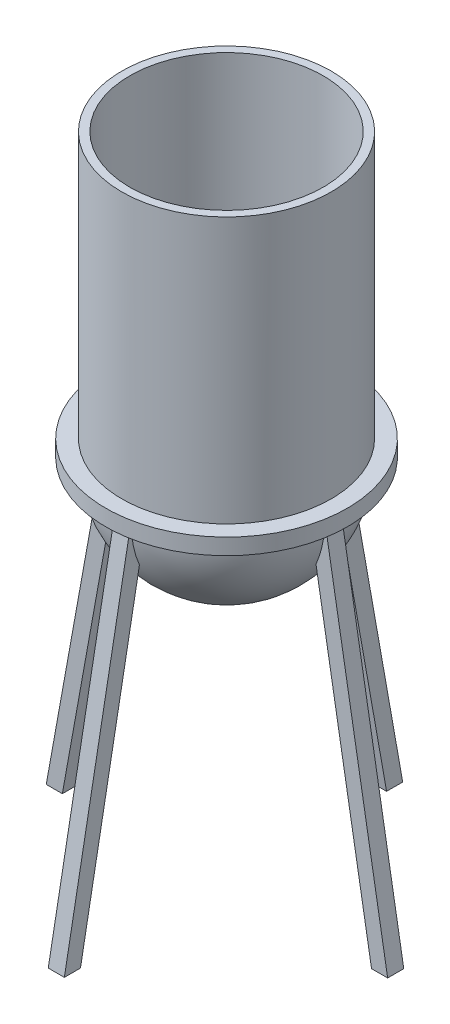
ISO-10303-21;
HEADER;
FILE_DESCRIPTION(('STEP AP214'),'2;1');
FILE_NAME('part.step','',(''),(''),'','','');
FILE_SCHEMA(('AUTOMOTIVE_DESIGN { 1 0 10303 214 1 1 1 1 }'));
ENDSEC;
DATA;
#1=APPLICATION_CONTEXT('core data for automotive mechanical design processes');
#2=APPLICATION_PROTOCOL_DEFINITION('international standard','automotive_design',2000,#1);
#3=PRODUCT_CONTEXT('',#1,'mechanical');
#4=PRODUCT('Part','Part','',(#3));
#5=PRODUCT_RELATED_PRODUCT_CATEGORY('part','',(#4));
#6=PRODUCT_DEFINITION_FORMATION('','',#4);
#7=PRODUCT_DEFINITION_CONTEXT('part definition',#1,'design');
#8=PRODUCT_DEFINITION('design','',#6,#7);
#9=PRODUCT_DEFINITION_SHAPE('','',#8);
#10=(LENGTH_UNIT() NAMED_UNIT(*) SI_UNIT(.MILLI.,.METRE.));
#11=(NAMED_UNIT(*) PLANE_ANGLE_UNIT() SI_UNIT($,.RADIAN.));
#12=(NAMED_UNIT(*) SI_UNIT($,.STERADIAN.) SOLID_ANGLE_UNIT());
#13=UNCERTAINTY_MEASURE_WITH_UNIT(LENGTH_MEASURE(1.E-05),#10,'distance_accuracy_value','');
#14=(GEOMETRIC_REPRESENTATION_CONTEXT(3) GLOBAL_UNCERTAINTY_ASSIGNED_CONTEXT((#13)) GLOBAL_UNIT_ASSIGNED_CONTEXT((#10,
#11,#12)) REPRESENTATION_CONTEXT('',''));
#15=CARTESIAN_POINT('',(0.,0.,0.));
#16=DIRECTION('',(0.,0.,1.));
#17=DIRECTION('',(1.,0.,0.));
#18=AXIS2_PLACEMENT_3D('',#15,#16,#17);
#19=CARTESIAN_POINT('',(0.,0.,0.));
#20=DIRECTION('',(0.,1.,0.));
#21=DIRECTION('',(0.,0.,1.));
#22=AXIS2_PLACEMENT_3D('',#19,#20,#21);
#23=PLANE('',#22);
#24=CARTESIAN_POINT('',(0.,0.,0.));
#25=DIRECTION('',(0.,-1.,0.));
#26=DIRECTION('',(0.,0.,-1.));
#27=AXIS2_PLACEMENT_3D('',#24,#25,#26);
#28=CIRCLE('',#27,381.);
#29=CARTESIAN_POINT('',(0.,0.,-381.));
#30=VERTEX_POINT('',#29);
#31=EDGE_CURVE('E1510',#30,#30,#28,.T.);
#32=ORIENTED_EDGE('',*,*,#31,.T.);
#33=EDGE_LOOP('',(#32));
#34=FACE_BOUND('',#33,.T.);
#35=DIRECTION('',(1.,0.,0.));
#36=VECTOR('',#35,1.);
#37=CARTESIAN_POINT('',(-330.2,0.,30.7586720774848));
#38=LINE('',#37,#36);
#39=CARTESIAN_POINT('',(-330.2,-1.11022302462516E-13,30.7586720774848));
#40=VERTEX_POINT('',#39);
#41=CARTESIAN_POINT('',(-328.764268271401,0.,30.7586720774848));
#42=VERTEX_POINT('',#41);
#43=EDGE_CURVE('E73',#40,#42,#38,.T.);
#44=ORIENTED_EDGE('',*,*,#43,.T.);
#45=CARTESIAN_POINT('',(0.,0.,0.));
#46=DIRECTION('',(0.,1.,0.));
#47=DIRECTION('',(0.,0.,1.));
#48=AXIS2_PLACEMENT_3D('',#45,#46,#47);
#49=CIRCLE('',#48,330.2);
#50=CARTESIAN_POINT('',(-22.2603230003613,0.,329.448809407349));
#51=VERTEX_POINT('',#50);
#52=EDGE_CURVE('E1059',#42,#51,#49,.T.);
#53=ORIENTED_EDGE('',*,*,#52,.T.);
#54=DIRECTION('',(0.,0.,-1.));
#55=VECTOR('',#54,1.);
#56=CARTESIAN_POINT('',(-22.2603230003613,0.,330.2));
#57=LINE('',#56,#55);
#58=CARTESIAN_POINT('',(-22.2603230003613,0.,330.2));
#59=VERTEX_POINT('',#58);
#60=EDGE_CURVE('E881',#59,#51,#57,.T.);
#61=ORIENTED_EDGE('',*,*,#60,.F.);
#62=DIRECTION('',(1.,0.,0.));
#63=VECTOR('',#62,1.);
#64=CARTESIAN_POINT('',(-22.2603230003613,0.,330.2));
#65=LINE('',#64,#63);
#66=CARTESIAN_POINT('',(28.5396769996387,0.,330.2));
#67=VERTEX_POINT('',#66);
#68=EDGE_CURVE('E762',#59,#67,#65,.T.);
#69=ORIENTED_EDGE('',*,*,#68,.T.);
#70=DIRECTION('',(0.,0.,-1.));
#71=VECTOR('',#70,1.);
#72=CARTESIAN_POINT('',(28.5396769996387,0.,330.2));
#73=LINE('',#72,#71);
#74=CARTESIAN_POINT('',(28.5396769996387,0.,328.964324565379));
#75=VERTEX_POINT('',#74);
#76=EDGE_CURVE('E1523',#67,#75,#73,.T.);
#77=ORIENTED_EDGE('',*,*,#76,.T.);
#78=CARTESIAN_POINT('',(329.594157383324,0.,19.9932843419203));
#79=VERTEX_POINT('',#78);
#80=EDGE_CURVE('E1067',#75,#79,#49,.T.);
#81=ORIENTED_EDGE('',*,*,#80,.T.);
#82=DIRECTION('',(1.,0.,0.));
#83=VECTOR('',#82,1.);
#84=CARTESIAN_POINT('',(279.4,0.,19.9932843419203));
#85=LINE('',#84,#83);
#86=CARTESIAN_POINT('',(330.2,0.,19.9932843419203));
#87=VERTEX_POINT('',#86);
#88=EDGE_CURVE('E1094',#79,#87,#85,.T.);
#89=ORIENTED_EDGE('',*,*,#88,.T.);
#90=DIRECTION('',(0.,0.,-1.));
#91=VECTOR('',#90,1.);
#92=CARTESIAN_POINT('',(330.2,0.,19.9932843419203));
#93=LINE('',#92,#91);
#94=CARTESIAN_POINT('',(330.2,0.,-30.8067156580797));
#95=VERTEX_POINT('',#94);
#96=EDGE_CURVE('E1082',#87,#95,#93,.T.);
#97=ORIENTED_EDGE('',*,*,#96,.T.);
#98=DIRECTION('',(1.,0.,0.));
#99=VECTOR('',#98,1.);
#100=CARTESIAN_POINT('',(279.4,0.,-30.8067156580797));
#101=LINE('',#100,#99);
#102=CARTESIAN_POINT('',(328.759769847775,0.,-30.8067156580797));
#103=VERTEX_POINT('',#102);
#104=EDGE_CURVE('E1083',#103,#95,#101,.T.);
#105=ORIENTED_EDGE('',*,*,#104,.F.);
#106=CARTESIAN_POINT('',(22.2603230003613,0.,-329.448809407349));
#107=VERTEX_POINT('',#106);
#108=EDGE_CURVE('E1058',#103,#107,#49,.T.);
#109=ORIENTED_EDGE('',*,*,#108,.T.);
#110=DIRECTION('',(0.,0.,-1.));
#111=VECTOR('',#110,1.);
#112=CARTESIAN_POINT('',(22.2603230003613,0.,-279.4));
#113=LINE('',#112,#111);
#114=CARTESIAN_POINT('',(22.2603230003613,0.,-330.2));
#115=VERTEX_POINT('',#114);
#116=EDGE_CURVE('E539',#107,#115,#113,.T.);
#117=ORIENTED_EDGE('',*,*,#116,.T.);
#118=DIRECTION('',(1.,0.,0.));
#119=VECTOR('',#118,1.);
#120=CARTESIAN_POINT('',(-28.5396769996387,0.,-330.2));
#121=LINE('',#120,#119);
#122=CARTESIAN_POINT('',(-28.5396769996387,0.,-330.2));
#123=VERTEX_POINT('',#122);
#124=EDGE_CURVE('E1106',#123,#115,#121,.T.);
#125=ORIENTED_EDGE('',*,*,#124,.F.);
#126=DIRECTION('',(0.,0.,-1.));
#127=VECTOR('',#126,1.);
#128=CARTESIAN_POINT('',(-28.5396769996387,0.,-279.4));
#129=LINE('',#128,#127);
#130=CARTESIAN_POINT('',(-28.5396769996387,0.,-328.96432456538));
#131=VERTEX_POINT('',#130);
#132=EDGE_CURVE('E430',#131,#123,#129,.T.);
#133=ORIENTED_EDGE('',*,*,#132,.F.);
#134=CARTESIAN_POINT('',(-329.591239530274,0.,-20.0413279225152));
#135=VERTEX_POINT('',#134);
#136=EDGE_CURVE('E1054',#131,#135,#49,.T.);
#137=ORIENTED_EDGE('',*,*,#136,.T.);
#138=DIRECTION('',(1.,0.,0.));
#139=VECTOR('',#138,1.);
#140=CARTESIAN_POINT('',(-330.2,0.,-20.0413279225152));
#141=LINE('',#140,#139);
#142=CARTESIAN_POINT('',(-330.2,0.,-20.0413279225152));
#143=VERTEX_POINT('',#142);
#144=EDGE_CURVE('E1544',#143,#135,#141,.T.);
#145=ORIENTED_EDGE('',*,*,#144,.F.);
#146=DIRECTION('',(0.,0.,-1.));
#147=VECTOR('',#146,1.);
#148=CARTESIAN_POINT('',(-330.2,0.,30.7586720774848));
#149=LINE('',#148,#147);
#150=EDGE_CURVE('E87',#40,#143,#149,.T.);
#151=ORIENTED_EDGE('',*,*,#150,.F.);
#152=EDGE_LOOP('',(#44,#53,#61,#69,#77,#81,#89,#97,#105,#109,#117,#125,#133,#137,#145,#151));
#153=FACE_BOUND('',#152,.T.);
#154=ADVANCED_FACE('F69',(#34,#153),#23,.F.);
#155=CARTESIAN_POINT('',(0.,0.,0.));
#156=DIRECTION('',(1.,0.,0.));
#157=DIRECTION('',(0.,0.,-1.));
#158=AXIS2_PLACEMENT_3D('',#155,#156,#157);
#159=SPHERICAL_SURFACE('',#158,330.2);
#160=ORIENTED_EDGE('',*,*,#52,.F.);
#161=CARTESIAN_POINT('',(0.,0.115879031097051,30.7582355131102));
#162=DIRECTION('',(0.,-0.00376738804463848,-0.999992903368479));
#163=DIRECTION('',(0.,0.99999290336848,-0.00376738804463848));
#164=AXIS2_PLACEMENT_3D('',#161,#162,#163);
#165=CIRCLE('',#164,328.764288693541);
#166=CARTESIAN_POINT('',(-302.337885821098,-129.025607743678,31.2447650591733));
#167=VERTEX_POINT('',#166);
#168=EDGE_CURVE('E424',#42,#167,#165,.F.);
#169=ORIENTED_EDGE('',*,*,#168,.T.);
#170=CARTESIAN_POINT('',(-270.840114887506,48.1493537577788,0.));
#171=DIRECTION('',(-0.984562507785907,0.175033334717494,0.));
#172=DIRECTION('',(-0.175033334717494,-0.984562507785907,0.));
#173=AXIS2_PLACEMENT_3D('',#170,#171,#172);
#174=CIRCLE('',#173,182.645317214624);
#175=CARTESIAN_POINT('',(-302.625485592681,-130.643356458827,-19.5491402104059));
#176=VERTEX_POINT('',#175);
#177=EDGE_CURVE('E287',#167,#176,#174,.F.);
#178=ORIENTED_EDGE('',*,*,#177,.T.);
#179=CARTESIAN_POINT('',(0.,-0.0755029233937347,-20.0410434716856));
#180=DIRECTION('',(0.,-0.00376738804463848,-0.999992903368479));
#181=DIRECTION('',(0.,0.99999290336848,-0.00376738804463848));
#182=AXIS2_PLACEMENT_3D('',#179,#180,#181);
#183=CIRCLE('',#182,329.59124817852);
#184=EDGE_CURVE('E426',#135,#176,#183,.F.);
#185=ORIENTED_EDGE('',*,*,#184,.F.);
#186=ORIENTED_EDGE('',*,*,#136,.F.);
#187=CARTESIAN_POINT('',(-28.5396762928073,0.00449140701348873,0.));
#188=DIRECTION('',(0.99999998761669,-0.00015737413808727,0.));
#189=DIRECTION('',(0.00015737413808727,0.99999998761669,0.));
#190=AXIS2_PLACEMENT_3D('',#187,#188,#189);
#191=CIRCLE('',#190,328.96432459604);
#192=CARTESIAN_POINT('',(-28.5600513311017,-129.464291009632,-302.415873957268));
#193=VERTEX_POINT('',#192);
#194=EDGE_CURVE('E556',#131,#193,#191,.F.);
#195=ORIENTED_EDGE('',*,*,#194,.T.);
#196=CARTESIAN_POINT('',(0.,48.1493537577788,-270.840114887506));
#197=DIRECTION('',(0.,-0.175033334717495,0.984562507785907));
#198=DIRECTION('',(0.,-0.984562507785907,-0.175033334717495));
#199=AXIS2_PLACEMENT_3D('',#196,#197,#198);
#200=CIRCLE('',#199,182.645317214625);
#201=CARTESIAN_POINT('',(22.2398111246173,-130.338286451184,-302.571250924655));
#202=VERTEX_POINT('',#201);
#203=EDGE_CURVE('E555',#202,#193,#200,.F.);
#204=ORIENTED_EDGE('',*,*,#203,.F.);
#205=CARTESIAN_POINT('',(22.2603224490484,-0.00350319910234503,0.));
#206=DIRECTION('',(0.99999998761669,-0.000157374138087276,0.));
#207=DIRECTION('',(0.000157374138087276,0.99999998761669,0.));
#208=AXIS2_PLACEMENT_3D('',#205,#206,#207);
#209=CIRCLE('',#208,329.448809425974);
#210=EDGE_CURVE('E553',#107,#202,#209,.F.);
#211=ORIENTED_EDGE('',*,*,#210,.F.);
#212=ORIENTED_EDGE('',*,*,#108,.F.);
#213=CARTESIAN_POINT('',(0.,-0.145721281763995,-30.8060263548987));
#214=DIRECTION('',(0.,0.00473023199462276,0.999988812390057));
#215=DIRECTION('',(0.,-0.999988812390057,0.00473023199462276));
#216=AXIS2_PLACEMENT_3D('',#213,#214,#215);
#217=CIRCLE('',#216,328.759802143646);
#218=CARTESIAN_POINT('',(302.369220991674,-129.201868078165,-30.1955540104932));
#219=VERTEX_POINT('',#218);
#220=EDGE_CURVE('E702',#103,#219,#217,.F.);
#221=ORIENTED_EDGE('',*,*,#220,.T.);
#222=CARTESIAN_POINT('',(270.840114887506,48.1493537577788,0.));
#223=DIRECTION('',(0.984562507785907,0.175033334717494,0.));
#224=DIRECTION('',(-0.175033334717494,0.984562507785907,0.));
#225=AXIS2_PLACEMENT_3D('',#222,#223,#224);
#226=CIRCLE('',#225,182.645317214624);
#227=CARTESIAN_POINT('',(302.604932906533,-130.527747599248,20.6107177774048));
#228=VERTEX_POINT('',#227);
#229=EDGE_CURVE('E746',#219,#228,#226,.F.);
#230=ORIENTED_EDGE('',*,*,#229,.T.);
#231=CARTESIAN_POINT('',(0.,0.0945718152273244,19.9928369902894));
#232=DIRECTION('',(0.,0.00473023199462276,0.999988812390057));
#233=DIRECTION('',(0.,-0.999988812390057,0.00473023199462276));
#234=AXIS2_PLACEMENT_3D('',#231,#232,#233);
#235=CIRCLE('',#234,329.594170951568);
#236=EDGE_CURVE('E741',#79,#228,#235,.F.);
#237=ORIENTED_EDGE('',*,*,#236,.F.);
#238=ORIENTED_EDGE('',*,*,#80,.F.);
#239=CARTESIAN_POINT('',(28.5387656089709,-0.161276051062973,0.));
#240=DIRECTION('',(0.999984032791541,-0.00565103193825426,0.));
#241=DIRECTION('',(0.00565103193825426,0.999984032791541,0.));
#242=AXIS2_PLACEMENT_3D('',#239,#240,#241);
#243=CIRCLE('',#242,328.964364099748);
#244=CARTESIAN_POINT('',(27.8074044511206,-129.580024351419,302.436448773585));
#245=VERTEX_POINT('',#244);
#246=EDGE_CURVE('E854',#245,#75,#243,.F.);
#247=ORIENTED_EDGE('',*,*,#246,.F.);
#248=CARTESIAN_POINT('',(0.,48.1493537577788,270.840114887506));
#249=DIRECTION('',(0.,0.175033334717495,0.984562507785906));
#250=DIRECTION('',(0.,-0.984562507785907,0.175033334717495));
#251=AXIS2_PLACEMENT_3D('',#248,#249,#250);
#252=CIRCLE('',#251,182.645317214625);
#253=CARTESIAN_POINT('',(-22.996355269862,-130.245329554331,302.554725254103));
#254=VERTEX_POINT('',#253);
#255=EDGE_CURVE('E851',#245,#254,#252,.F.);
#256=ORIENTED_EDGE('',*,*,#255,.T.);
#257=CARTESIAN_POINT('',(-22.2596121356012,0.125791787655131,0.));
#258=DIRECTION('',(0.999984032791541,-0.00565103193825428,0.));
#259=DIRECTION('',(0.00565103193825428,0.999984032791541,0.));
#260=AXIS2_PLACEMENT_3D('',#257,#258,#259);
#261=CIRCLE('',#260,329.448833423339);
#262=EDGE_CURVE('E855',#254,#51,#261,.F.);
#263=ORIENTED_EDGE('',*,*,#262,.T.);
#264=EDGE_LOOP('',(#160,#169,#178,#185,#186,#195,#204,#211,#212,#221,#230,#237,#238,#247,#256,#263));
#265=FACE_BOUND('',#264,.T.);
#266=ADVANCED_FACE('F967',(#265),#159,.T.);
#267=CARTESIAN_POINT('',(0.,0.,0.));
#268=DIRECTION('',(1.,0.,0.));
#269=DIRECTION('',(0.,0.,-1.));
#270=AXIS2_PLACEMENT_3D('',#267,#268,#269);
#271=SPHERICAL_SURFACE('',#270,304.8);
#272=CARTESIAN_POINT('',(0.,0.115879031097051,30.7582355131102));
#273=DIRECTION('',(0.,-0.00376738804463848,-0.999992903368479));
#274=DIRECTION('',(0.,0.99999290336848,-0.00376738804463848));
#275=AXIS2_PLACEMENT_3D('',#272,#273,#274);
#276=CIRCLE('',#275,303.24405603436);
#277=CARTESIAN_POINT('',(-303.244033893546,0.,30.7586720774848));
#278=VERTEX_POINT('',#277);
#279=CARTESIAN_POINT('',(-293.16368536909,-77.4207302011311,31.0503480807688));
#280=VERTEX_POINT('',#279);
#281=EDGE_CURVE('E12',#278,#280,#276,.F.);
#282=ORIENTED_EDGE('',*,*,#281,.F.);
#283=CARTESIAN_POINT('',(0.,0.,0.));
#284=DIRECTION('',(0.,1.,0.));
#285=DIRECTION('',(0.,0.,1.));
#286=AXIS2_PLACEMENT_3D('',#283,#284,#285);
#287=CIRCLE('',#286,304.8);
#288=CARTESIAN_POINT('',(-22.2603230003613,0.,303.986049054755));
#289=VERTEX_POINT('',#288);
#290=EDGE_CURVE('E1000',#278,#289,#287,.T.);
#291=ORIENTED_EDGE('',*,*,#290,.T.);
#292=CARTESIAN_POINT('',(-22.2596121356012,0.125791787655131,0.));
#293=DIRECTION('',(0.999984032791541,-0.00565103193825428,0.));
#294=DIRECTION('',(0.00565103193825428,0.999984032791541,0.));
#295=AXIS2_PLACEMENT_3D('',#292,#293,#294);
#296=CIRCLE('',#295,303.986075082394);
#297=CARTESIAN_POINT('',(-22.707553192434,-79.1400678569084,293.469345396784));
#298=VERTEX_POINT('',#297);
#299=EDGE_CURVE('E1496',#298,#289,#296,.F.);
#300=ORIENTED_EDGE('',*,*,#299,.F.);
#301=CARTESIAN_POINT('',(0.,48.1493537577788,270.840114887506));
#302=DIRECTION('',(0.,0.175033334717495,0.984562507785906));
#303=DIRECTION('',(0.,-0.984562507785907,0.175033334717495));
#304=AXIS2_PLACEMENT_3D('',#301,#302,#303);
#305=CIRCLE('',#304,131.264282653092);
#306=CARTESIAN_POINT('',(28.0983645699337,-78.0928842730509,293.28317942632));
#307=VERTEX_POINT('',#306);
#308=EDGE_CURVE('E1489',#307,#298,#305,.F.);
#309=ORIENTED_EDGE('',*,*,#308,.F.);
#310=CARTESIAN_POINT('',(28.5387656089709,-0.161276051062973,0.));
#311=DIRECTION('',(0.999984032791541,-0.00565103193825426,0.));
#312=DIRECTION('',(0.00565103193825426,0.999984032791541,0.));
#313=AXIS2_PLACEMENT_3D('',#310,#311,#312);
#314=CIRCLE('',#313,303.46095769893);
#315=CARTESIAN_POINT('',(28.5396769996387,0.,303.460914842021));
#316=VERTEX_POINT('',#315);
#317=EDGE_CURVE('E1491',#307,#316,#314,.F.);
#318=ORIENTED_EDGE('',*,*,#317,.T.);
#319=CARTESIAN_POINT('',(304.143565740298,0.,19.9932843419203));
#320=VERTEX_POINT('',#319);
#321=EDGE_CURVE('E1023',#316,#320,#287,.T.);
#322=ORIENTED_EDGE('',*,*,#321,.T.);
#323=CARTESIAN_POINT('',(0.,0.0945718152273244,19.9928369902894));
#324=DIRECTION('',(0.,0.00473023199462276,0.999988812390057));
#325=DIRECTION('',(0.,-0.999988812390057,0.00473023199462276));
#326=AXIS2_PLACEMENT_3D('',#323,#324,#325);
#327=CIRCLE('',#326,304.143580443927);
#328=CARTESIAN_POINT('',(293.537422020359,-79.5229988645161,20.3694507838611));
#329=VERTEX_POINT('',#328);
#330=EDGE_CURVE('E1047',#320,#329,#327,.F.);
#331=ORIENTED_EDGE('',*,*,#330,.T.);
#332=CARTESIAN_POINT('',(270.840114887506,48.1493537577788,0.));
#333=DIRECTION('',(0.984562507785907,0.175033334717494,0.));
#334=DIRECTION('',(-0.175033334717494,0.984562507785907,0.));
#335=AXIS2_PLACEMENT_3D('',#332,#333,#334);
#336=CIRCLE('',#335,131.264282653092);
#337=CARTESIAN_POINT('',(293.189431794533,-77.565553844247,-30.4398084887907));
#338=VERTEX_POINT('',#337);
#339=EDGE_CURVE('E1495',#338,#329,#336,.F.);
#340=ORIENTED_EDGE('',*,*,#339,.F.);
#341=CARTESIAN_POINT('',(0.,-0.145721281763995,-30.8060263548987));
#342=DIRECTION('',(0.,0.00473023199462276,0.999988812390057));
#343=DIRECTION('',(0.,-0.999988812390057,0.00473023199462276));
#344=AXIS2_PLACEMENT_3D('',#341,#342,#343);
#345=CIRCLE('',#344,303.23919190225);
#346=CARTESIAN_POINT('',(303.239156888358,0.,-30.8067156580797));
#347=VERTEX_POINT('',#346);
#348=EDGE_CURVE('E1493',#347,#338,#345,.F.);
#349=ORIENTED_EDGE('',*,*,#348,.F.);
#350=CARTESIAN_POINT('',(22.2603230003613,0.,-303.986049054754));
#351=VERTEX_POINT('',#350);
#352=EDGE_CURVE('E1036',#347,#351,#287,.T.);
#353=ORIENTED_EDGE('',*,*,#352,.T.);
#354=CARTESIAN_POINT('',(22.2603224490484,-0.00350319910234503,0.));
#355=DIRECTION('',(0.99999998761669,-0.000157374138087276,0.));
#356=DIRECTION('',(0.000157374138087276,0.99999998761669,0.));
#357=AXIS2_PLACEMENT_3D('',#354,#355,#356);
#358=CIRCLE('',#357,303.98604907494);
#359=CARTESIAN_POINT('',(22.2478560203365,-79.2187332811113,-293.483330361086));
#360=VERTEX_POINT('',#359);
#361=EDGE_CURVE('E535',#351,#360,#358,.F.);
#362=ORIENTED_EDGE('',*,*,#361,.T.);
#363=CARTESIAN_POINT('',(0.,48.1493537577788,-270.840114887506));
#364=DIRECTION('',(0.,-0.175033334717495,0.984562507785907));
#365=DIRECTION('',(0.,-0.984562507785907,-0.175033334717495));
#366=AXIS2_PLACEMENT_3D('',#363,#364,#365);
#367=CIRCLE('',#366,131.264282653092);
#368=CARTESIAN_POINT('',(-28.5519512684898,-77.9941917287445,-293.26563408511));
#369=VERTEX_POINT('',#368);
#370=EDGE_CURVE('E542',#360,#369,#367,.F.);
#371=ORIENTED_EDGE('',*,*,#370,.T.);
#372=CARTESIAN_POINT('',(-28.5396762928073,0.00449140701348873,0.));
#373=DIRECTION('',(0.99999998761669,-0.00015737413808727,0.));
#374=DIRECTION('',(0.00015737413808727,0.99999998761669,0.));
#375=AXIS2_PLACEMENT_3D('',#372,#373,#374);
#376=CIRCLE('',#375,303.460914875259);
#377=CARTESIAN_POINT('',(-28.5396769996387,0.,-303.460914842021));
#378=VERTEX_POINT('',#377);
#379=EDGE_CURVE('E1044',#378,#369,#376,.F.);
#380=ORIENTED_EDGE('',*,*,#379,.F.);
#381=CARTESIAN_POINT('',(-304.140403720226,0.,-20.0413279225152));
#382=VERTEX_POINT('',#381);
#383=EDGE_CURVE('E1013',#378,#382,#287,.T.);
#384=ORIENTED_EDGE('',*,*,#383,.T.);
#385=CARTESIAN_POINT('',(0.,-0.0755029233937347,-20.0410434716856));
#386=DIRECTION('',(0.,-0.00376738804463848,-0.999992903368479));
#387=DIRECTION('',(0.,0.99999290336848,-0.00376738804463848));
#388=AXIS2_PLACEMENT_3D('',#385,#386,#387);
#389=CIRCLE('',#388,304.140413092168);
#390=CARTESIAN_POINT('',(-293.554418171355,-79.6186022138738,-19.7413716237245));
#391=VERTEX_POINT('',#390);
#392=EDGE_CURVE('E1019',#382,#391,#389,.F.);
#393=ORIENTED_EDGE('',*,*,#392,.T.);
#394=CARTESIAN_POINT('',(-270.840114887506,48.1493537577788,0.));
#395=DIRECTION('',(-0.984562507785907,0.175033334717494,0.));
#396=DIRECTION('',(-0.175033334717494,-0.984562507785907,0.));
#397=AXIS2_PLACEMENT_3D('',#394,#395,#396);
#398=CIRCLE('',#397,131.264282653092);
#399=EDGE_CURVE('E79',#280,#391,#398,.F.);
#400=ORIENTED_EDGE('',*,*,#399,.F.);
#401=EDGE_LOOP('',(#282,#291,#300,#309,#318,#322,#331,#340,#349,#353,#362,#371,#380,#384,#393,#400));
#402=FACE_BOUND('',#401,.T.);
#403=ADVANCED_FACE('F973',(#402),#271,.F.);
#404=CARTESIAN_POINT('',(0.,889.,0.));
#405=DIRECTION('',(0.,-1.,0.));
#406=DIRECTION('',(0.,0.,-1.));
#407=AXIS2_PLACEMENT_3D('',#404,#405,#406);
#408=CYLINDRICAL_SURFACE('',#407,330.2);
#409=CARTESIAN_POINT('',(0.,889.,0.));
#410=DIRECTION('',(0.,1.,0.));
#411=DIRECTION('',(0.,0.,1.));
#412=AXIS2_PLACEMENT_3D('',#409,#410,#411);
#413=CIRCLE('',#412,330.2);
#414=CARTESIAN_POINT('',(0.,889.,330.2));
#415=VERTEX_POINT('',#414);
#416=EDGE_CURVE('E1502',#415,#415,#413,.T.);
#417=ORIENTED_EDGE('',*,*,#416,.F.);
#418=EDGE_LOOP('',(#417));
#419=FACE_BOUND('',#418,.T.);
#420=CARTESIAN_POINT('',(0.,50.8,0.));
#421=DIRECTION('',(0.,-1.,0.));
#422=DIRECTION('',(0.,0.,-1.));
#423=AXIS2_PLACEMENT_3D('',#420,#421,#422);
#424=CIRCLE('',#423,330.2);
#425=CARTESIAN_POINT('',(0.,50.8,-330.2));
#426=VERTEX_POINT('',#425);
#427=EDGE_CURVE('E1500',#426,#426,#424,.T.);
#428=ORIENTED_EDGE('',*,*,#427,.F.);
#429=EDGE_LOOP('',(#428));
#430=FACE_BOUND('',#429,.T.);
#431=ADVANCED_FACE('F71',(#419,#430),#408,.T.);
#432=CARTESIAN_POINT('',(0.,12.7,0.));
#433=DIRECTION('',(0.,1.,0.));
#434=DIRECTION('',(0.,0.,1.));
#435=AXIS2_PLACEMENT_3D('',#432,#433,#434);
#436=CYLINDRICAL_SURFACE('',#435,304.8);
#437=CARTESIAN_POINT('',(0.,889.,0.));
#438=DIRECTION('',(0.,1.,0.));
#439=DIRECTION('',(0.,0.,1.));
#440=AXIS2_PLACEMENT_3D('',#437,#438,#439);
#441=CIRCLE('',#440,304.8);
#442=CARTESIAN_POINT('',(0.,889.,304.8));
#443=VERTEX_POINT('',#442);
#444=EDGE_CURVE('E1507',#443,#443,#441,.T.);
#445=ORIENTED_EDGE('',*,*,#444,.T.);
#446=EDGE_LOOP('',(#445));
#447=FACE_BOUND('',#446,.T.);
#448=ORIENTED_EDGE('',*,*,#321,.F.);
#449=EDGE_CURVE('E1011',#289,#316,#287,.T.);
#450=ORIENTED_EDGE('',*,*,#449,.F.);
#451=ORIENTED_EDGE('',*,*,#290,.F.);
#452=EDGE_CURVE('E1009',#382,#278,#287,.T.);
#453=ORIENTED_EDGE('',*,*,#452,.F.);
#454=ORIENTED_EDGE('',*,*,#383,.F.);
#455=EDGE_CURVE('E1040',#351,#378,#287,.T.);
#456=ORIENTED_EDGE('',*,*,#455,.F.);
#457=ORIENTED_EDGE('',*,*,#352,.F.);
#458=EDGE_CURVE('E1032',#320,#347,#287,.T.);
#459=ORIENTED_EDGE('',*,*,#458,.F.);
#460=EDGE_LOOP('',(#448,#450,#451,#453,#454,#456,#457,#459));
#461=FACE_BOUND('',#460,.T.);
#462=ADVANCED_FACE('F981',(#447,#461),#436,.F.);
#463=CARTESIAN_POINT('',(0.,889.,0.));
#464=DIRECTION('',(0.,1.,0.));
#465=DIRECTION('',(0.,0.,1.));
#466=AXIS2_PLACEMENT_3D('',#463,#464,#465);
#467=PLANE('',#466);
#468=ORIENTED_EDGE('',*,*,#444,.F.);
#469=EDGE_LOOP('',(#468));
#470=FACE_BOUND('',#469,.T.);
#471=ORIENTED_EDGE('',*,*,#416,.T.);
#472=EDGE_LOOP('',(#471));
#473=FACE_BOUND('',#472,.T.);
#474=ADVANCED_FACE('F977',(#470,#473),#467,.T.);
#475=CARTESIAN_POINT('',(0.,50.8,0.));
#476=DIRECTION('',(0.,-1.,0.));
#477=DIRECTION('',(0.,0.,-1.));
#478=AXIS2_PLACEMENT_3D('',#475,#476,#477);
#479=PLANE('',#478);
#480=CARTESIAN_POINT('',(0.,50.8,0.));
#481=DIRECTION('',(0.,-1.,0.));
#482=DIRECTION('',(0.,0.,-1.));
#483=AXIS2_PLACEMENT_3D('',#480,#481,#482);
#484=CIRCLE('',#483,381.);
#485=CARTESIAN_POINT('',(0.,50.8,-381.));
#486=VERTEX_POINT('',#485);
#487=EDGE_CURVE('E1513',#486,#486,#484,.T.);
#488=ORIENTED_EDGE('',*,*,#487,.F.);
#489=EDGE_LOOP('',(#488));
#490=FACE_BOUND('',#489,.T.);
#491=ORIENTED_EDGE('',*,*,#427,.T.);
#492=EDGE_LOOP('',(#491));
#493=FACE_BOUND('',#492,.T.);
#494=ADVANCED_FACE('F980',(#490,#493),#479,.F.);
#495=CARTESIAN_POINT('',(0.,50.8,0.));
#496=DIRECTION('',(0.,-1.,0.));
#497=DIRECTION('',(0.,0.,-1.));
#498=AXIS2_PLACEMENT_3D('',#495,#496,#497);
#499=CYLINDRICAL_SURFACE('',#498,381.);
#500=ORIENTED_EDGE('',*,*,#487,.T.);
#501=EDGE_LOOP('',(#500));
#502=FACE_BOUND('',#501,.T.);
#503=ORIENTED_EDGE('',*,*,#31,.F.);
#504=EDGE_LOOP('',(#503));
#505=FACE_BOUND('',#504,.T.);
#506=ADVANCED_FACE('F986',(#502,#505),#499,.T.);
#507=CARTESIAN_POINT('',(-22.2596121356012,0.125791787655131,0.));
#508=DIRECTION('',(0.999984032791541,-0.00565103193825428,0.));
#509=DIRECTION('',(0.00565103193825428,0.999984032791541,0.));
#510=AXIS2_PLACEMENT_3D('',#507,#508,#509);
#511=PLANE('',#510);
#512=DIRECTION('',(-0.00556379689839446,-0.984547268690246,0.175030625544933));
#513=VECTOR('',#512,1.);
#514=CARTESIAN_POINT('',(-22.2603230003613,0.,279.4));
#515=LINE('',#514,#513);
#516=CARTESIAN_POINT('',(-22.2603230003613,0.,279.4));
#517=VERTEX_POINT('',#516);
#518=EDGE_CURVE('E769',#517,#298,#515,.T.);
#519=ORIENTED_EDGE('',*,*,#518,.T.);
#520=ORIENTED_EDGE('',*,*,#299,.T.);
#521=EDGE_CURVE('E751',#289,#517,#57,.T.);
#522=ORIENTED_EDGE('',*,*,#521,.T.);
#523=EDGE_LOOP('',(#519,#520,#522));
#524=FACE_BOUND('',#523,.T.);
#525=ADVANCED_FACE('F784',(#524),#511,.F.);
#526=CARTESIAN_POINT('',(0.,48.1493537577788,270.840114887506));
#527=DIRECTION('',(0.,0.175033334717495,0.984562507785906));
#528=DIRECTION('',(0.,-0.984562507785907,0.175033334717495));
#529=AXIS2_PLACEMENT_3D('',#526,#527,#528);
#530=PLANE('',#529);
#531=DIRECTION('',(-0.00556379689839446,-0.984547268690246,0.175030625544933));
#532=VECTOR('',#531,1.);
#533=CARTESIAN_POINT('',(28.5396769996387,0.,279.4));
#534=LINE('',#533,#532);
#535=CARTESIAN_POINT('',(28.5396769996387,0.,279.4));
#536=VERTEX_POINT('',#535);
#537=EDGE_CURVE('E756',#536,#307,#534,.T.);
#538=ORIENTED_EDGE('',*,*,#537,.T.);
#539=ORIENTED_EDGE('',*,*,#308,.T.);
#540=ORIENTED_EDGE('',*,*,#518,.F.);
#541=DIRECTION('',(1.,0.,0.));
#542=VECTOR('',#541,1.);
#543=CARTESIAN_POINT('',(-22.2603230003613,0.,279.4));
#544=LINE('',#543,#542);
#545=EDGE_CURVE('E879',#517,#536,#544,.T.);
#546=ORIENTED_EDGE('',*,*,#545,.T.);
#547=EDGE_LOOP('',(#538,#539,#540,#546));
#548=FACE_BOUND('',#547,.T.);
#549=ADVANCED_FACE('F824',(#548),#530,.F.);
#550=CARTESIAN_POINT('',(28.5387656089708,-0.161276051062973,0.));
#551=DIRECTION('',(0.999984032791541,-0.00565103193825426,0.));
#552=DIRECTION('',(0.00565103193825426,0.999984032791541,0.));
#553=AXIS2_PLACEMENT_3D('',#550,#551,#552);
#554=PLANE('',#553);
#555=ORIENTED_EDGE('',*,*,#317,.F.);
#556=ORIENTED_EDGE('',*,*,#537,.F.);
#557=EDGE_CURVE('E862',#316,#536,#73,.T.);
#558=ORIENTED_EDGE('',*,*,#557,.F.);
#559=EDGE_LOOP('',(#555,#556,#558));
#560=FACE_BOUND('',#559,.T.);
#561=ADVANCED_FACE('F965',(#560),#554,.T.);
#562=CARTESIAN_POINT('',(0.,0.,0.));
#563=DIRECTION('',(0.,-1.,0.));
#564=DIRECTION('',(0.,0.,-1.));
#565=AXIS2_PLACEMENT_3D('',#562,#563,#564);
#566=PLANE('',#565);
#567=ORIENTED_EDGE('',*,*,#521,.F.);
#568=ORIENTED_EDGE('',*,*,#449,.T.);
#569=ORIENTED_EDGE('',*,*,#557,.T.);
#570=ORIENTED_EDGE('',*,*,#545,.F.);
#571=EDGE_LOOP('',(#567,#568,#569,#570));
#572=FACE_BOUND('',#571,.T.);
#573=ADVANCED_FACE('F660',(#572),#566,.F.);
#574=CARTESIAN_POINT('',(0.,-1143.,0.));
#575=DIRECTION('',(0.,-1.,0.));
#576=DIRECTION('',(0.,0.,-1.));
#577=AXIS2_PLACEMENT_3D('',#574,#575,#576);
#578=PLANE('',#577);
#579=DIRECTION('',(0.,0.,-1.));
#580=VECTOR('',#579,1.);
#581=CARTESIAN_POINT('',(-28.7195556417,-1143.,533.4));
#582=LINE('',#581,#580);
#583=CARTESIAN_POINT('',(-28.7195556417,-1143.,533.4));
#584=VERTEX_POINT('',#583);
#585=CARTESIAN_POINT('',(-28.7195556417,-1143.,482.6));
#586=VERTEX_POINT('',#585);
#587=EDGE_CURVE('E929',#584,#586,#582,.T.);
#588=ORIENTED_EDGE('',*,*,#587,.T.);
#589=DIRECTION('',(1.,0.,0.));
#590=VECTOR('',#589,1.);
#591=CARTESIAN_POINT('',(-28.7195556417,-1143.,482.6));
#592=LINE('',#591,#590);
#593=CARTESIAN_POINT('',(22.0804443583,-1143.,482.6));
#594=VERTEX_POINT('',#593);
#595=EDGE_CURVE('E808',#586,#594,#592,.T.);
#596=ORIENTED_EDGE('',*,*,#595,.T.);
#597=DIRECTION('',(0.,0.,-1.));
#598=VECTOR('',#597,1.);
#599=CARTESIAN_POINT('',(22.0804443583,-1143.,533.4));
#600=LINE('',#599,#598);
#601=CARTESIAN_POINT('',(22.0804443583,-1143.,533.4));
#602=VERTEX_POINT('',#601);
#603=EDGE_CURVE('E902',#602,#594,#600,.T.);
#604=ORIENTED_EDGE('',*,*,#603,.F.);
#605=DIRECTION('',(1.,0.,0.));
#606=VECTOR('',#605,1.);
#607=CARTESIAN_POINT('',(-28.7195556417,-1143.,533.4));
#608=LINE('',#607,#606);
#609=EDGE_CURVE('E898',#584,#602,#608,.T.);
#610=ORIENTED_EDGE('',*,*,#609,.F.);
#611=EDGE_LOOP('',(#588,#596,#604,#610));
#612=FACE_BOUND('',#611,.T.);
#613=ADVANCED_FACE('F787',(#612),#578,.T.);
#614=EDGE_CURVE('E761',#245,#594,#534,.T.);
#615=ORIENTED_EDGE('',*,*,#614,.F.);
#616=ORIENTED_EDGE('',*,*,#246,.T.);
#617=ORIENTED_EDGE('',*,*,#76,.F.);
#618=DIRECTION('',(-0.00556379689839445,-0.984547268690246,0.175030625544933));
#619=VECTOR('',#618,1.);
#620=CARTESIAN_POINT('',(28.5396769996387,0.,330.2));
#621=LINE('',#620,#619);
#622=EDGE_CURVE('E759',#67,#602,#621,.T.);
#623=ORIENTED_EDGE('',*,*,#622,.T.);
#624=ORIENTED_EDGE('',*,*,#603,.T.);
#625=EDGE_LOOP('',(#615,#616,#617,#623,#624));
#626=FACE_BOUND('',#625,.T.);
#627=ADVANCED_FACE('F823',(#626),#554,.T.);
#628=ORIENTED_EDGE('',*,*,#255,.F.);
#629=ORIENTED_EDGE('',*,*,#614,.T.);
#630=ORIENTED_EDGE('',*,*,#595,.F.);
#631=EDGE_CURVE('E755',#254,#586,#515,.T.);
#632=ORIENTED_EDGE('',*,*,#631,.F.);
#633=EDGE_LOOP('',(#628,#629,#630,#632));
#634=FACE_BOUND('',#633,.T.);
#635=ADVANCED_FACE('F815',(#634),#530,.F.);
#636=CARTESIAN_POINT('',(0.,56.9037817137386,320.08377213978));
#637=DIRECTION('',(0.,0.175033334717495,0.984562507785906));
#638=DIRECTION('',(0.,-0.984562507785907,0.175033334717495));
#639=AXIS2_PLACEMENT_3D('',#636,#637,#638);
#640=PLANE('',#639);
#641=DIRECTION('',(-0.00556379689839445,-0.984547268690246,0.175030625544933));
#642=VECTOR('',#641,1.);
#643=CARTESIAN_POINT('',(-22.2603230003613,0.,330.2));
#644=LINE('',#643,#642);
#645=EDGE_CURVE('E752',#59,#584,#644,.T.);
#646=ORIENTED_EDGE('',*,*,#645,.T.);
#647=ORIENTED_EDGE('',*,*,#609,.T.);
#648=ORIENTED_EDGE('',*,*,#622,.F.);
#649=ORIENTED_EDGE('',*,*,#68,.F.);
#650=EDGE_LOOP('',(#646,#647,#648,#649));
#651=FACE_BOUND('',#650,.T.);
#652=ADVANCED_FACE('F782',(#651),#640,.T.);
#653=ORIENTED_EDGE('',*,*,#262,.F.);
#654=ORIENTED_EDGE('',*,*,#631,.T.);
#655=ORIENTED_EDGE('',*,*,#587,.F.);
#656=ORIENTED_EDGE('',*,*,#645,.F.);
#657=ORIENTED_EDGE('',*,*,#60,.T.);
#658=EDGE_LOOP('',(#653,#654,#655,#656,#657));
#659=FACE_BOUND('',#658,.T.);
#660=ADVANCED_FACE('F772',(#659),#511,.F.);
#661=CARTESIAN_POINT('',(0.,0.0945718152273244,19.9928369902894));
#662=DIRECTION('',(0.,0.00473023199462276,0.999988812390057));
#663=DIRECTION('',(0.,-0.999988812390057,0.00473023199462276));
#664=AXIS2_PLACEMENT_3D('',#661,#662,#663);
#665=PLANE('',#664);
#666=ORIENTED_EDGE('',*,*,#330,.F.);
#667=CARTESIAN_POINT('',(279.4,0.,19.9932843419203));
#668=VERTEX_POINT('',#667);
#669=EDGE_CURVE('E568',#668,#320,#85,.T.);
#670=ORIENTED_EDGE('',*,*,#669,.F.);
#671=DIRECTION('',(0.17503143650471,-0.984551830338993,0.00465721067129031));
#672=VECTOR('',#671,1.);
#673=CARTESIAN_POINT('',(279.4,0.,19.9932843419203));
#674=LINE('',#673,#672);
#675=EDGE_CURVE('E574',#668,#329,#674,.T.);
#676=ORIENTED_EDGE('',*,*,#675,.T.);
#677=EDGE_LOOP('',(#666,#670,#676));
#678=FACE_BOUND('',#677,.T.);
#679=ADVANCED_FACE('F589',(#678),#665,.T.);
#680=CARTESIAN_POINT('',(0.,-0.145721281763995,-30.8060263548987));
#681=DIRECTION('',(0.,0.00473023199462276,0.999988812390057));
#682=DIRECTION('',(0.,-0.999988812390057,0.00473023199462276));
#683=AXIS2_PLACEMENT_3D('',#680,#681,#682);
#684=PLANE('',#683);
#685=CARTESIAN_POINT('',(279.4,0.,-30.8067156580797));
#686=VERTEX_POINT('',#685);
#687=EDGE_CURVE('E1079',#686,#347,#101,.T.);
#688=ORIENTED_EDGE('',*,*,#687,.T.);
#689=ORIENTED_EDGE('',*,*,#348,.T.);
#690=DIRECTION('',(0.17503143650471,-0.984551830338993,0.00465721067129031));
#691=VECTOR('',#690,1.);
#692=CARTESIAN_POINT('',(279.4,0.,-30.8067156580797));
#693=LINE('',#692,#691);
#694=EDGE_CURVE('E721',#686,#338,#693,.T.);
#695=ORIENTED_EDGE('',*,*,#694,.F.);
#696=EDGE_LOOP('',(#688,#689,#695));
#697=FACE_BOUND('',#696,.T.);
#698=ADVANCED_FACE('F1357',(#697),#684,.F.);
#699=CARTESIAN_POINT('',(270.840114887506,48.1493537577788,0.));
#700=DIRECTION('',(0.984562507785907,0.175033334717494,0.));
#701=DIRECTION('',(-0.175033334717494,0.984562507785907,0.));
#702=AXIS2_PLACEMENT_3D('',#699,#700,#701);
#703=PLANE('',#702);
#704=ORIENTED_EDGE('',*,*,#694,.T.);
#705=ORIENTED_EDGE('',*,*,#339,.T.);
#706=ORIENTED_EDGE('',*,*,#675,.F.);
#707=DIRECTION('',(0.,0.,-1.));
#708=VECTOR('',#707,1.);
#709=CARTESIAN_POINT('',(279.4,0.,19.9932843419203));
#710=LINE('',#709,#708);
#711=EDGE_CURVE('E561',#668,#686,#710,.T.);
#712=ORIENTED_EDGE('',*,*,#711,.T.);
#713=EDGE_LOOP('',(#704,#705,#706,#712));
#714=FACE_BOUND('',#713,.T.);
#715=ADVANCED_FACE('F1369',(#714),#703,.F.);
#716=CARTESIAN_POINT('',(0.,0.,0.));
#717=DIRECTION('',(0.,-1.,0.));
#718=DIRECTION('',(0.,0.,-1.));
#719=AXIS2_PLACEMENT_3D('',#716,#717,#718);
#720=PLANE('',#719);
#721=ORIENTED_EDGE('',*,*,#669,.T.);
#722=ORIENTED_EDGE('',*,*,#458,.T.);
#723=ORIENTED_EDGE('',*,*,#687,.F.);
#724=ORIENTED_EDGE('',*,*,#711,.F.);
#725=EDGE_LOOP('',(#721,#722,#723,#724));
#726=FACE_BOUND('',#725,.T.);
#727=ADVANCED_FACE('F658',(#726),#720,.F.);
#728=CARTESIAN_POINT('',(0.,-1143.,0.));
#729=DIRECTION('',(0.,-1.,0.));
#730=DIRECTION('',(0.,0.,-1.));
#731=AXIS2_PLACEMENT_3D('',#728,#729,#730);
#732=PLANE('',#731);
#733=DIRECTION('',(0.,0.,-1.));
#734=VECTOR('',#733,1.);
#735=CARTESIAN_POINT('',(482.6,-1143.,25.4));
#736=LINE('',#735,#734);
#737=CARTESIAN_POINT('',(482.6,-1143.,25.4));
#738=VERTEX_POINT('',#737);
#739=CARTESIAN_POINT('',(482.6,-1143.,-25.4));
#740=VERTEX_POINT('',#739);
#741=EDGE_CURVE('E612',#738,#740,#736,.T.);
#742=ORIENTED_EDGE('',*,*,#741,.T.);
#743=DIRECTION('',(1.,0.,0.));
#744=VECTOR('',#743,1.);
#745=CARTESIAN_POINT('',(482.6,-1143.,-25.4));
#746=LINE('',#745,#744);
#747=CARTESIAN_POINT('',(533.4,-1143.,-25.4));
#748=VERTEX_POINT('',#747);
#749=EDGE_CURVE('E626',#740,#748,#746,.T.);
#750=ORIENTED_EDGE('',*,*,#749,.T.);
#751=DIRECTION('',(0.,0.,-1.));
#752=VECTOR('',#751,1.);
#753=CARTESIAN_POINT('',(533.4,-1143.,25.4));
#754=LINE('',#753,#752);
#755=CARTESIAN_POINT('',(533.4,-1143.,25.4));
#756=VERTEX_POINT('',#755);
#757=EDGE_CURVE('E639',#756,#748,#754,.T.);
#758=ORIENTED_EDGE('',*,*,#757,.F.);
#759=DIRECTION('',(1.,0.,0.));
#760=VECTOR('',#759,1.);
#761=CARTESIAN_POINT('',(482.6,-1143.,25.4));
#762=LINE('',#761,#760);
#763=EDGE_CURVE('E691',#738,#756,#762,.T.);
#764=ORIENTED_EDGE('',*,*,#763,.F.);
#765=EDGE_LOOP('',(#742,#750,#758,#764));
#766=FACE_BOUND('',#765,.T.);
#767=ADVANCED_FACE('F654',(#766),#732,.T.);
#768=ORIENTED_EDGE('',*,*,#229,.F.);
#769=EDGE_CURVE('E729',#219,#740,#693,.T.);
#770=ORIENTED_EDGE('',*,*,#769,.T.);
#771=ORIENTED_EDGE('',*,*,#741,.F.);
#772=EDGE_CURVE('E728',#228,#738,#674,.T.);
#773=ORIENTED_EDGE('',*,*,#772,.F.);
#774=EDGE_LOOP('',(#768,#770,#771,#773));
#775=FACE_BOUND('',#774,.T.);
#776=ADVANCED_FACE('F587',(#775),#703,.F.);
#777=ORIENTED_EDGE('',*,*,#88,.F.);
#778=ORIENTED_EDGE('',*,*,#236,.T.);
#779=ORIENTED_EDGE('',*,*,#772,.T.);
#780=ORIENTED_EDGE('',*,*,#763,.T.);
#781=DIRECTION('',(0.17503143650471,-0.984551830338993,0.00465721067129031));
#782=VECTOR('',#781,1.);
#783=CARTESIAN_POINT('',(330.2,0.,19.9932843419203));
#784=LINE('',#783,#782);
#785=EDGE_CURVE('E704',#87,#756,#784,.T.);
#786=ORIENTED_EDGE('',*,*,#785,.F.);
#787=EDGE_LOOP('',(#777,#778,#779,#780,#786));
#788=FACE_BOUND('',#787,.T.);
#789=ADVANCED_FACE('F576',(#788),#665,.T.);
#790=ORIENTED_EDGE('',*,*,#220,.F.);
#791=ORIENTED_EDGE('',*,*,#104,.T.);
#792=DIRECTION('',(0.17503143650471,-0.984551830338993,0.00465721067129031));
#793=VECTOR('',#792,1.);
#794=CARTESIAN_POINT('',(330.2,0.,-30.8067156580797));
#795=LINE('',#794,#793);
#796=EDGE_CURVE('E705',#95,#748,#795,.T.);
#797=ORIENTED_EDGE('',*,*,#796,.T.);
#798=ORIENTED_EDGE('',*,*,#749,.F.);
#799=ORIENTED_EDGE('',*,*,#769,.F.);
#800=EDGE_LOOP('',(#790,#791,#797,#798,#799));
#801=FACE_BOUND('',#800,.T.);
#802=ADVANCED_FACE('F586',(#801),#684,.F.);
#803=CARTESIAN_POINT('',(320.08377213978,56.9037817137386,0.));
#804=DIRECTION('',(0.984562507785907,0.175033334717494,0.));
#805=DIRECTION('',(-0.175033334717494,0.984562507785907,0.));
#806=AXIS2_PLACEMENT_3D('',#803,#804,#805);
#807=PLANE('',#806);
#808=ORIENTED_EDGE('',*,*,#785,.T.);
#809=ORIENTED_EDGE('',*,*,#757,.T.);
#810=ORIENTED_EDGE('',*,*,#796,.F.);
#811=ORIENTED_EDGE('',*,*,#96,.F.);
#812=EDGE_LOOP('',(#808,#809,#810,#811));
#813=FACE_BOUND('',#812,.T.);
#814=ADVANCED_FACE('F645',(#813),#807,.T.);
#815=CARTESIAN_POINT('',(-28.5396762928073,0.00449140701348873,0.));
#816=DIRECTION('',(0.99999998761669,-0.00015737413808727,0.));
#817=DIRECTION('',(0.00015737413808727,0.99999998761669,0.));
#818=AXIS2_PLACEMENT_3D('',#815,#816,#817);
#819=PLANE('',#818);
#820=CARTESIAN_POINT('',(-28.5396769996387,0.,-279.4));
#821=VERTEX_POINT('',#820);
#822=EDGE_CURVE('E1060',#821,#378,#129,.T.);
#823=ORIENTED_EDGE('',*,*,#822,.T.);
#824=ORIENTED_EDGE('',*,*,#379,.T.);
#825=DIRECTION('',(-0.000154944676114658,-0.984562495967291,-0.175033332616407));
#826=VECTOR('',#825,1.);
#827=CARTESIAN_POINT('',(-28.5396769996387,0.,-279.4));
#828=LINE('',#827,#826);
#829=EDGE_CURVE('E442',#821,#369,#828,.T.);
#830=ORIENTED_EDGE('',*,*,#829,.F.);
#831=EDGE_LOOP('',(#823,#824,#830));
#832=FACE_BOUND('',#831,.T.);
#833=ADVANCED_FACE('F495',(#832),#819,.F.);
#834=CARTESIAN_POINT('',(22.2603224490484,-0.00350319910234503,0.));
#835=DIRECTION('',(0.99999998761669,-0.000157374138087276,0.));
#836=DIRECTION('',(0.000157374138087276,0.99999998761669,0.));
#837=AXIS2_PLACEMENT_3D('',#834,#835,#836);
#838=PLANE('',#837);
#839=ORIENTED_EDGE('',*,*,#361,.F.);
#840=CARTESIAN_POINT('',(22.2603230003613,0.,-279.4));
#841=VERTEX_POINT('',#840);
#842=EDGE_CURVE('E526',#841,#351,#113,.T.);
#843=ORIENTED_EDGE('',*,*,#842,.F.);
#844=DIRECTION('',(-0.000154944676114661,-0.984562495967291,-0.175033332616407));
#845=VECTOR('',#844,1.);
#846=CARTESIAN_POINT('',(22.2603230003613,0.,-279.4));
#847=LINE('',#846,#845);
#848=EDGE_CURVE('E514',#841,#360,#847,.T.);
#849=ORIENTED_EDGE('',*,*,#848,.T.);
#850=EDGE_LOOP('',(#839,#843,#849));
#851=FACE_BOUND('',#850,.T.);
#852=ADVANCED_FACE('F534',(#851),#838,.T.);
#853=CARTESIAN_POINT('',(0.,48.1493537577788,-270.840114887506));
#854=DIRECTION('',(0.,-0.175033334717495,0.984562507785907));
#855=DIRECTION('',(0.,-0.984562507785907,-0.175033334717495));
#856=AXIS2_PLACEMENT_3D('',#853,#854,#855);
#857=PLANE('',#856);
#858=ORIENTED_EDGE('',*,*,#370,.F.);
#859=ORIENTED_EDGE('',*,*,#848,.F.);
#860=DIRECTION('',(1.,0.,0.));
#861=VECTOR('',#860,1.);
#862=CARTESIAN_POINT('',(-28.5396769996387,0.,-279.4));
#863=LINE('',#862,#861);
#864=EDGE_CURVE('E436',#821,#841,#863,.T.);
#865=ORIENTED_EDGE('',*,*,#864,.F.);
#866=ORIENTED_EDGE('',*,*,#829,.T.);
#867=EDGE_LOOP('',(#858,#859,#865,#866));
#868=FACE_BOUND('',#867,.T.);
#869=ADVANCED_FACE('F457',(#868),#857,.T.);
#870=CARTESIAN_POINT('',(0.,0.,0.));
#871=DIRECTION('',(0.,-1.,0.));
#872=DIRECTION('',(0.,0.,-1.));
#873=AXIS2_PLACEMENT_3D('',#870,#871,#872);
#874=PLANE('',#873);
#875=ORIENTED_EDGE('',*,*,#842,.T.);
#876=ORIENTED_EDGE('',*,*,#455,.T.);
#877=ORIENTED_EDGE('',*,*,#822,.F.);
#878=ORIENTED_EDGE('',*,*,#864,.T.);
#879=EDGE_LOOP('',(#875,#876,#877,#878));
#880=FACE_BOUND('',#879,.T.);
#881=ADVANCED_FACE('F458',(#880),#874,.F.);
#882=CARTESIAN_POINT('',(0.,-1143.,0.));
#883=DIRECTION('',(0.,-1.,0.));
#884=DIRECTION('',(0.,0.,-1.));
#885=AXIS2_PLACEMENT_3D('',#882,#883,#884);
#886=PLANE('',#885);
#887=DIRECTION('',(0.,0.,-1.));
#888=VECTOR('',#887,1.);
#889=CARTESIAN_POINT('',(-28.7195556417,-1143.,-482.6));
#890=LINE('',#889,#888);
#891=CARTESIAN_POINT('',(-28.7195556417,-1143.,-482.6));
#892=VERTEX_POINT('',#891);
#893=CARTESIAN_POINT('',(-28.7195556417,-1143.,-533.4));
#894=VERTEX_POINT('',#893);
#895=EDGE_CURVE('E480',#892,#894,#890,.T.);
#896=ORIENTED_EDGE('',*,*,#895,.T.);
#897=DIRECTION('',(1.,0.,0.));
#898=VECTOR('',#897,1.);
#899=CARTESIAN_POINT('',(-28.7195556417,-1143.,-533.4));
#900=LINE('',#899,#898);
#901=CARTESIAN_POINT('',(22.0804443583,-1143.,-533.4));
#902=VERTEX_POINT('',#901);
#903=EDGE_CURVE('E1144',#894,#902,#900,.T.);
#904=ORIENTED_EDGE('',*,*,#903,.T.);
#905=DIRECTION('',(0.,0.,-1.));
#906=VECTOR('',#905,1.);
#907=CARTESIAN_POINT('',(22.0804443583,-1143.,-482.6));
#908=LINE('',#907,#906);
#909=CARTESIAN_POINT('',(22.0804443583,-1143.,-482.6));
#910=VERTEX_POINT('',#909);
#911=EDGE_CURVE('E1140',#910,#902,#908,.T.);
#912=ORIENTED_EDGE('',*,*,#911,.F.);
#913=DIRECTION('',(1.,0.,0.));
#914=VECTOR('',#913,1.);
#915=CARTESIAN_POINT('',(-28.7195556417,-1143.,-482.6));
#916=LINE('',#915,#914);
#917=EDGE_CURVE('E1143',#892,#910,#916,.T.);
#918=ORIENTED_EDGE('',*,*,#917,.F.);
#919=EDGE_LOOP('',(#896,#904,#912,#918));
#920=FACE_BOUND('',#919,.T.);
#921=ADVANCED_FACE('F455',(#920),#886,.T.);
#922=EDGE_CURVE('E543',#202,#910,#847,.T.);
#923=ORIENTED_EDGE('',*,*,#922,.F.);
#924=ORIENTED_EDGE('',*,*,#203,.T.);
#925=EDGE_CURVE('E1162',#193,#892,#828,.T.);
#926=ORIENTED_EDGE('',*,*,#925,.T.);
#927=ORIENTED_EDGE('',*,*,#917,.T.);
#928=EDGE_LOOP('',(#923,#924,#926,#927));
#929=FACE_BOUND('',#928,.T.);
#930=ADVANCED_FACE('F444',(#929),#857,.T.);
#931=ORIENTED_EDGE('',*,*,#116,.F.);
#932=ORIENTED_EDGE('',*,*,#210,.T.);
#933=ORIENTED_EDGE('',*,*,#922,.T.);
#934=ORIENTED_EDGE('',*,*,#911,.T.);
#935=DIRECTION('',(-0.000154944676114655,-0.984562495967291,-0.175033332616407));
#936=VECTOR('',#935,1.);
#937=CARTESIAN_POINT('',(22.2603230003613,0.,-330.2));
#938=LINE('',#937,#936);
#939=EDGE_CURVE('E513',#115,#902,#938,.T.);
#940=ORIENTED_EDGE('',*,*,#939,.F.);
#941=EDGE_LOOP('',(#931,#932,#933,#934,#940));
#942=FACE_BOUND('',#941,.T.);
#943=ADVANCED_FACE('F454',(#942),#838,.T.);
#944=ORIENTED_EDGE('',*,*,#194,.F.);
#945=ORIENTED_EDGE('',*,*,#132,.T.);
#946=DIRECTION('',(-0.000154944676114655,-0.984562495967291,-0.175033332616407));
#947=VECTOR('',#946,1.);
#948=CARTESIAN_POINT('',(-28.5396769996387,0.,-330.2));
#949=LINE('',#948,#947);
#950=EDGE_CURVE('E506',#123,#894,#949,.T.);
#951=ORIENTED_EDGE('',*,*,#950,.T.);
#952=ORIENTED_EDGE('',*,*,#895,.F.);
#953=ORIENTED_EDGE('',*,*,#925,.F.);
#954=EDGE_LOOP('',(#944,#945,#951,#952,#953));
#955=FACE_BOUND('',#954,.T.);
#956=ADVANCED_FACE('F485',(#955),#819,.F.);
#957=CARTESIAN_POINT('',(0.,56.9037817137386,-320.08377213978));
#958=DIRECTION('',(0.,-0.175033334717495,0.984562507785907));
#959=DIRECTION('',(0.,-0.984562507785907,-0.175033334717495));
#960=AXIS2_PLACEMENT_3D('',#957,#958,#959);
#961=PLANE('',#960);
#962=ORIENTED_EDGE('',*,*,#939,.T.);
#963=ORIENTED_EDGE('',*,*,#903,.F.);
#964=ORIENTED_EDGE('',*,*,#950,.F.);
#965=ORIENTED_EDGE('',*,*,#124,.T.);
#966=EDGE_LOOP('',(#962,#963,#964,#965));
#967=FACE_BOUND('',#966,.T.);
#968=ADVANCED_FACE('F494',(#967),#961,.F.);
#969=CARTESIAN_POINT('',(0.,-0.0755029233937347,-20.0410434716856));
#970=DIRECTION('',(0.,-0.00376738804463848,-0.999992903368479));
#971=DIRECTION('',(0.,0.99999290336848,-0.00376738804463848));
#972=AXIS2_PLACEMENT_3D('',#969,#970,#971);
#973=PLANE('',#972);
#974=ORIENTED_EDGE('',*,*,#392,.F.);
#975=CARTESIAN_POINT('',(-279.4,0.,-20.0413279225152));
#976=VERTEX_POINT('',#975);
#977=EDGE_CURVE('E1540',#382,#976,#141,.T.);
#978=ORIENTED_EDGE('',*,*,#977,.T.);
#979=DIRECTION('',(0.17503213062527,0.984555734767142,-0.00370922982747929));
#980=VECTOR('',#979,1.);
#981=CARTESIAN_POINT('',(-482.6,-1143.,-15.7351728282975));
#982=LINE('',#981,#980);
#983=EDGE_CURVE('E302',#391,#976,#982,.T.);
#984=ORIENTED_EDGE('',*,*,#983,.F.);
#985=EDGE_LOOP('',(#974,#978,#984));
#986=FACE_BOUND('',#985,.T.);
#987=ADVANCED_FACE('F377',(#986),#973,.T.);
#988=CARTESIAN_POINT('',(0.,0.115879031097051,30.7582355131102));
#989=DIRECTION('',(0.,-0.00376738804463848,-0.999992903368479));
#990=DIRECTION('',(0.,0.99999290336848,-0.00376738804463848));
#991=AXIS2_PLACEMENT_3D('',#988,#989,#990);
#992=PLANE('',#991);
#993=CARTESIAN_POINT('',(-279.4,0.,30.7586720774848));
#994=VERTEX_POINT('',#993);
#995=EDGE_CURVE('E420',#278,#994,#38,.T.);
#996=ORIENTED_EDGE('',*,*,#995,.F.);
#997=ORIENTED_EDGE('',*,*,#281,.T.);
#998=DIRECTION('',(0.17503213062527,0.984555734767142,-0.00370922982747929));
#999=VECTOR('',#998,1.);
#1000=CARTESIAN_POINT('',(-482.6,-1143.,35.0648271717025));
#1001=LINE('',#1000,#999);
#1002=EDGE_CURVE('E291',#280,#994,#1001,.T.);
#1003=ORIENTED_EDGE('',*,*,#1002,.T.);
#1004=EDGE_LOOP('',(#996,#997,#1003));
#1005=FACE_BOUND('',#1004,.T.);
#1006=ADVANCED_FACE('F1234',(#1005),#992,.F.);
#1007=CARTESIAN_POINT('',(-270.840114887506,48.1493537577788,0.));
#1008=DIRECTION('',(-0.984562507785907,0.175033334717494,0.));
#1009=DIRECTION('',(-0.175033334717494,-0.984562507785907,0.));
#1010=AXIS2_PLACEMENT_3D('',#1007,#1008,#1009);
#1011=PLANE('',#1010);
#1012=ORIENTED_EDGE('',*,*,#1002,.F.);
#1013=ORIENTED_EDGE('',*,*,#399,.T.);
#1014=ORIENTED_EDGE('',*,*,#983,.T.);
#1015=DIRECTION('',(0.,0.,-1.));
#1016=VECTOR('',#1015,1.);
#1017=CARTESIAN_POINT('',(-279.4,0.,30.7586720774848));
#1018=LINE('',#1017,#1016);
#1019=EDGE_CURVE('E1552',#994,#976,#1018,.T.);
#1020=ORIENTED_EDGE('',*,*,#1019,.F.);
#1021=EDGE_LOOP('',(#1012,#1013,#1014,#1020));
#1022=FACE_BOUND('',#1021,.T.);
#1023=ADVANCED_FACE('F1241',(#1022),#1011,.F.);
#1024=CARTESIAN_POINT('',(0.,0.,0.));
#1025=DIRECTION('',(0.,-1.,0.));
#1026=DIRECTION('',(0.,0.,-1.));
#1027=AXIS2_PLACEMENT_3D('',#1024,#1025,#1026);
#1028=PLANE('',#1027);
#1029=ORIENTED_EDGE('',*,*,#977,.F.);
#1030=ORIENTED_EDGE('',*,*,#452,.T.);
#1031=ORIENTED_EDGE('',*,*,#995,.T.);
#1032=ORIENTED_EDGE('',*,*,#1019,.T.);
#1033=EDGE_LOOP('',(#1029,#1030,#1031,#1032));
#1034=FACE_BOUND('',#1033,.T.);
#1035=ADVANCED_FACE('F329',(#1034),#1028,.F.);
#1036=CARTESIAN_POINT('',(0.,-1143.,0.));
#1037=DIRECTION('',(0.,1.,0.));
#1038=DIRECTION('',(0.,0.,1.));
#1039=AXIS2_PLACEMENT_3D('',#1036,#1037,#1038);
#1040=PLANE('',#1039);
#1041=DIRECTION('',(0.,0.,-1.));
#1042=VECTOR('',#1041,1.);
#1043=CARTESIAN_POINT('',(-482.6,-1143.,35.0648271717025));
#1044=LINE('',#1043,#1042);
#1045=CARTESIAN_POINT('',(-482.6,-1143.,35.0648271717025));
#1046=VERTEX_POINT('',#1045);
#1047=CARTESIAN_POINT('',(-482.6,-1143.,-15.7351728282975));
#1048=VERTEX_POINT('',#1047);
#1049=EDGE_CURVE('E284',#1046,#1048,#1044,.T.);
#1050=ORIENTED_EDGE('',*,*,#1049,.F.);
#1051=DIRECTION('',(-1.,0.,0.));
#1052=VECTOR('',#1051,1.);
#1053=CARTESIAN_POINT('',(-482.6,-1143.,35.0648271717025));
#1054=LINE('',#1053,#1052);
#1055=CARTESIAN_POINT('',(-533.4,-1143.,35.0648271717025));
#1056=VERTEX_POINT('',#1055);
#1057=EDGE_CURVE('E294',#1046,#1056,#1054,.T.);
#1058=ORIENTED_EDGE('',*,*,#1057,.T.);
#1059=DIRECTION('',(0.,0.,-1.));
#1060=VECTOR('',#1059,1.);
#1061=CARTESIAN_POINT('',(-533.4,-1143.,35.0648271717025));
#1062=LINE('',#1061,#1060);
#1063=CARTESIAN_POINT('',(-533.4,-1143.,-15.7351728282975));
#1064=VERTEX_POINT('',#1063);
#1065=EDGE_CURVE('E303',#1056,#1064,#1062,.T.);
#1066=ORIENTED_EDGE('',*,*,#1065,.T.);
#1067=DIRECTION('',(-1.,0.,0.));
#1068=VECTOR('',#1067,1.);
#1069=CARTESIAN_POINT('',(-482.6,-1143.,-15.7351728282975));
#1070=LINE('',#1069,#1068);
#1071=EDGE_CURVE('E309',#1048,#1064,#1070,.T.);
#1072=ORIENTED_EDGE('',*,*,#1071,.F.);
#1073=EDGE_LOOP('',(#1050,#1058,#1066,#1072));
#1074=FACE_BOUND('',#1073,.T.);
#1075=ADVANCED_FACE('F307',(#1074),#1040,.F.);
#1076=ORIENTED_EDGE('',*,*,#177,.F.);
#1077=EDGE_CURVE('E279',#1046,#167,#1001,.T.);
#1078=ORIENTED_EDGE('',*,*,#1077,.F.);
#1079=ORIENTED_EDGE('',*,*,#1049,.T.);
#1080=EDGE_CURVE('E1581',#1048,#176,#982,.T.);
#1081=ORIENTED_EDGE('',*,*,#1080,.T.);
#1082=EDGE_LOOP('',(#1076,#1078,#1079,#1081));
#1083=FACE_BOUND('',#1082,.T.);
#1084=ADVANCED_FACE('F281',(#1083),#1011,.F.);
#1085=ORIENTED_EDGE('',*,*,#168,.F.);
#1086=ORIENTED_EDGE('',*,*,#43,.F.);
#1087=DIRECTION('',(0.17503213062527,0.984555734767142,-0.0037092298274793));
#1088=VECTOR('',#1087,1.);
#1089=CARTESIAN_POINT('',(-533.4,-1143.,35.0648271717025));
#1090=LINE('',#1089,#1088);
#1091=EDGE_CURVE('E298',#1056,#40,#1090,.T.);
#1092=ORIENTED_EDGE('',*,*,#1091,.F.);
#1093=ORIENTED_EDGE('',*,*,#1057,.F.);
#1094=ORIENTED_EDGE('',*,*,#1077,.T.);
#1095=EDGE_LOOP('',(#1085,#1086,#1092,#1093,#1094));
#1096=FACE_BOUND('',#1095,.T.);
#1097=ADVANCED_FACE('F296',(#1096),#992,.F.);
#1098=ORIENTED_EDGE('',*,*,#144,.T.);
#1099=ORIENTED_EDGE('',*,*,#184,.T.);
#1100=ORIENTED_EDGE('',*,*,#1080,.F.);
#1101=ORIENTED_EDGE('',*,*,#1071,.T.);
#1102=DIRECTION('',(0.17503213062527,0.984555734767142,-0.0037092298274793));
#1103=VECTOR('',#1102,1.);
#1104=CARTESIAN_POINT('',(-533.4,-1143.,-15.7351728282975));
#1105=LINE('',#1104,#1103);
#1106=EDGE_CURVE('E290',#1064,#143,#1105,.T.);
#1107=ORIENTED_EDGE('',*,*,#1106,.T.);
#1108=EDGE_LOOP('',(#1098,#1099,#1100,#1101,#1107));
#1109=FACE_BOUND('',#1108,.T.);
#1110=ADVANCED_FACE('F366',(#1109),#973,.T.);
#1111=CARTESIAN_POINT('',(-320.08377213978,56.9037817137386,0.));
#1112=DIRECTION('',(-0.984562507785907,0.175033334717494,0.));
#1113=DIRECTION('',(-0.175033334717494,-0.984562507785907,0.));
#1114=AXIS2_PLACEMENT_3D('',#1111,#1112,#1113);
#1115=PLANE('',#1114);
#1116=ORIENTED_EDGE('',*,*,#1091,.T.);
#1117=ORIENTED_EDGE('',*,*,#150,.T.);
#1118=ORIENTED_EDGE('',*,*,#1106,.F.);
#1119=ORIENTED_EDGE('',*,*,#1065,.F.);
#1120=EDGE_LOOP('',(#1116,#1117,#1118,#1119));
#1121=FACE_BOUND('',#1120,.T.);
#1122=ADVANCED_FACE('F375',(#1121),#1115,.T.);
#1123=CLOSED_SHELL('',(#154,#266,#403,#431,#462,#474,#494,#506,#525,#549,#561,#573,#613,#627,
#635,#652,#660,#679,#698,#715,#727,#767,#776,#789,#802,#814,#833,#852,#869,#881,#921,#930,#943,
#956,#968,#987,#1006,#1023,#1035,#1075,#1084,#1097,#1110,#1122));
#1124=MANIFOLD_SOLID_BREP('B2',#1123);
#1125=ADVANCED_BREP_SHAPE_REPRESENTATION('',(#18,#1124),#14);
#1126=SHAPE_DEFINITION_REPRESENTATION(#9,#1125);
ENDSEC;
END-ISO-10303-21;
